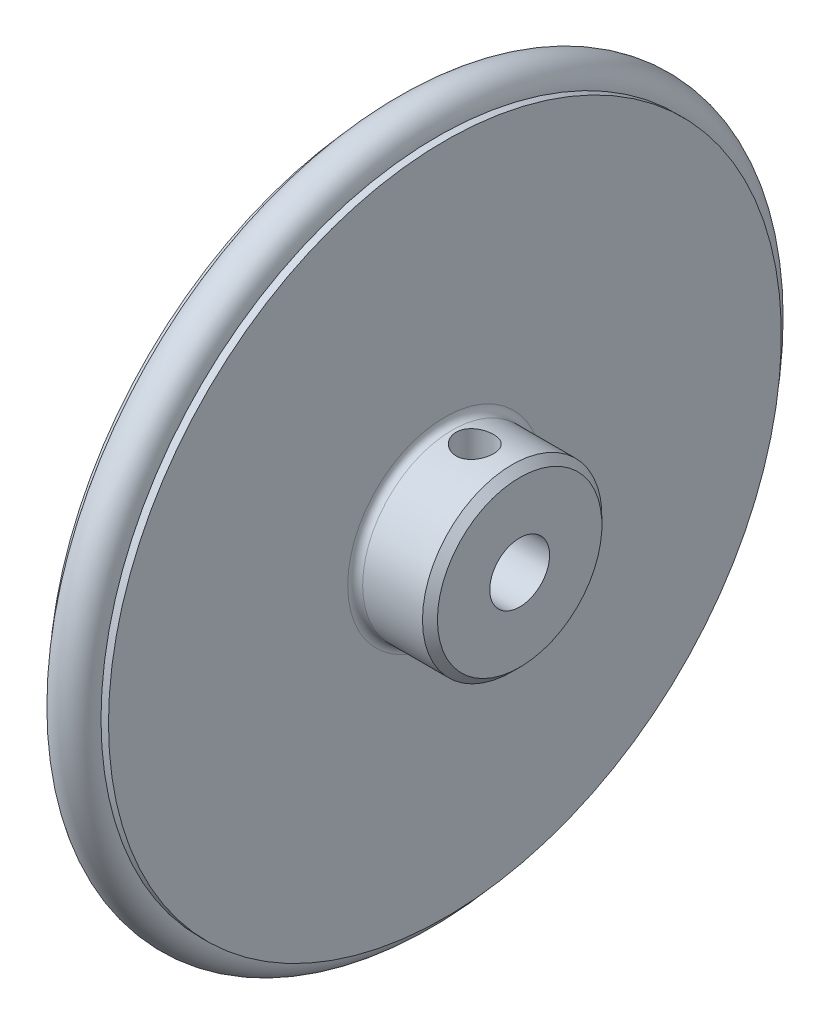
ISO-10303-21;
HEADER;
FILE_DESCRIPTION(('STEP AP214'),'2;1');
FILE_NAME('part.step','',(''),(''),'','','');
FILE_SCHEMA(('AUTOMOTIVE_DESIGN { 1 0 10303 214 1 1 1 1 }'));
ENDSEC;
DATA;
#1=APPLICATION_CONTEXT('core data for automotive mechanical design processes');
#2=APPLICATION_PROTOCOL_DEFINITION('international standard','automotive_design',2000,#1);
#3=PRODUCT_CONTEXT('',#1,'mechanical');
#4=PRODUCT('Part','Part','',(#3));
#5=PRODUCT_RELATED_PRODUCT_CATEGORY('part','',(#4));
#6=PRODUCT_DEFINITION_FORMATION('','',#4);
#7=PRODUCT_DEFINITION_CONTEXT('part definition',#1,'design');
#8=PRODUCT_DEFINITION('design','',#6,#7);
#9=PRODUCT_DEFINITION_SHAPE('','',#8);
#10=(LENGTH_UNIT() NAMED_UNIT(*) SI_UNIT(.MILLI.,.METRE.));
#11=(NAMED_UNIT(*) PLANE_ANGLE_UNIT() SI_UNIT($,.RADIAN.));
#12=(NAMED_UNIT(*) SI_UNIT($,.STERADIAN.) SOLID_ANGLE_UNIT());
#13=UNCERTAINTY_MEASURE_WITH_UNIT(LENGTH_MEASURE(1.E-05),#10,'distance_accuracy_value','');
#14=(GEOMETRIC_REPRESENTATION_CONTEXT(3) GLOBAL_UNCERTAINTY_ASSIGNED_CONTEXT((#13)) GLOBAL_UNIT_ASSIGNED_CONTEXT((#10,
#11,#12)) REPRESENTATION_CONTEXT('',''));
#15=CARTESIAN_POINT('',(0.,0.,0.));
#16=DIRECTION('',(0.,0.,1.));
#17=DIRECTION('',(1.,0.,0.));
#18=AXIS2_PLACEMENT_3D('',#15,#16,#17);
#19=CARTESIAN_POINT('',(0.,0.,0.));
#20=DIRECTION('',(1.,0.,0.));
#21=DIRECTION('',(0.,0.,-1.));
#22=AXIS2_PLACEMENT_3D('',#19,#20,#21);
#23=TOROIDAL_SURFACE('',#22,22.5,1.5);
#24=CARTESIAN_POINT('',(0.,0.,-24.));
#25=VERTEX_POINT('',#24);
#26=VERTEX_LOOP('',#25);
#27=FACE_BOUND('',#26,.T.);
#28=ADVANCED_FACE('F38',(#27),#23,.T.);
#29=CLOSED_SHELL('',(#28));
#30=MANIFOLD_SOLID_BREP('B2',#29);
#31=CARTESIAN_POINT('',(0.,0.,0.));
#32=DIRECTION('',(-1.,0.,0.));
#33=DIRECTION('',(0.,0.,1.));
#34=AXIS2_PLACEMENT_3D('',#31,#32,#33);
#35=CYLINDRICAL_SURFACE('',#34,2.);
#36=CARTESIAN_POINT('',(4.,1.56124949959961,-1.24999999999999));
#37=CARTESIAN_POINT('',(3.93787971819707,1.56125800072559,-1.24999462210484));
#38=CARTESIAN_POINT('',(3.87566216462974,1.56502642708837,-1.24532693849665));
#39=CARTESIAN_POINT('',(3.75332367992062,1.57943717205479,-1.22698950832933));
#40=CARTESIAN_POINT('',(3.69320891363476,1.59009816464116,-1.2132953043055));
#41=CARTESIAN_POINT('',(3.57721767730116,1.61650085329042,-1.1778807391187));
#42=CARTESIAN_POINT('',(3.52130939131819,1.63219837418034,-1.15622993332784));
#43=CARTESIAN_POINT('',(3.41399113836185,1.66682950714433,-1.10571945561923));
#44=CARTESIAN_POINT('',(3.3625812941435,1.68576320748676,-1.07685958706091));
#45=CARTESIAN_POINT('',(3.25813484552302,1.72779611374712,-1.00823937928363));
#46=CARTESIAN_POINT('',(3.20580525916741,1.75111338227347,-0.967536093692494));
#47=CARTESIAN_POINT('',(3.10811730085504,1.79752820854877,-0.878308664496871));
#48=CARTESIAN_POINT('',(3.06276500271608,1.8206255586333,-0.829777781297405));
#49=CARTESIAN_POINT('',(2.97489641485188,1.8672945389101,-0.719186665258484));
#50=CARTESIAN_POINT('',(2.9333823318957,1.8905872224145,-0.656200568910549));
#51=CARTESIAN_POINT('',(2.86187479523685,1.9318323169914,-0.52240407083731));
#52=CARTESIAN_POINT('',(2.83186993424875,1.94979001179838,-0.451601506478236));
#53=CARTESIAN_POINT('',(2.78751768939295,1.97669841318201,-0.311776878362014));
#54=CARTESIAN_POINT('',(2.77188858360307,1.98637922422038,-0.243305636047237));
#55=CARTESIAN_POINT('',(2.75236793035661,1.99850544379202,-0.10410510066226));
#56=CARTESIAN_POINT('',(2.74846404387946,2.00095845843657,-0.0333782605640244));
#57=CARTESIAN_POINT('',(2.75235568927762,1.99852909107528,0.0980658284213418));
#58=CARTESIAN_POINT('',(2.75865137630091,1.99458699811902,0.158852523273787));
#59=CARTESIAN_POINT('',(2.77986698436333,1.98145272261225,0.27830664590367));
#60=CARTESIAN_POINT('',(2.79478755723752,1.97226014325117,0.336973913146974));
#61=CARTESIAN_POINT('',(2.83260377509713,1.94938133614675,0.450889117077072));
#62=CARTESIAN_POINT('',(2.8555198240486,1.93568361673912,0.506127875493232));
#63=CARTESIAN_POINT('',(2.90846875526,1.90485632889331,0.612019220469381));
#64=CARTESIAN_POINT('',(2.93850325889061,1.88772597874226,0.662670758559999));
#65=CARTESIAN_POINT('',(3.00902816532938,1.84893224750793,0.764713515567039));
#66=CARTESIAN_POINT('',(3.05035462674234,1.82697004307144,0.815412344918947));
#67=CARTESIAN_POINT('',(3.14013238022338,1.78195462752237,0.909598595905495));
#68=CARTESIAN_POINT('',(3.18859402644656,1.75889986449171,0.953075338789628));
#69=CARTESIAN_POINT('',(3.29870562290611,1.71071442112196,1.03735445892931));
#70=CARTESIAN_POINT('',(3.36125138085031,1.68570581533195,1.07706615479946));
#71=CARTESIAN_POINT('',(3.49364611977343,1.640141390954,1.14526153203308));
#72=CARTESIAN_POINT('',(3.56348134395542,1.6195774019168,1.17376589603357));
#73=CARTESIAN_POINT('',(3.68976940288788,1.59091876567121,1.21218566853166));
#74=CARTESIAN_POINT('',(3.74491096263768,1.58096704305273,1.2250184172172));
#75=CARTESIAN_POINT('',(3.85711518874894,1.56679138875766,1.24310168537523));
#76=CARTESIAN_POINT('',(3.9141751210399,1.56255963237429,1.24836256353274));
#77=CARTESIAN_POINT('',(4.02872868054027,1.56046133530165,1.25098535954507));
#78=CARTESIAN_POINT('',(4.08622300136582,1.56260938140436,1.24832917576575));
#79=CARTESIAN_POINT('',(4.1997805810316,1.57296042862706,1.23525733555986));
#80=CARTESIAN_POINT('',(4.25584261496293,1.58116844404657,1.22483525320261));
#81=CARTESIAN_POINT('',(4.36421838386581,1.60230060601958,1.19704935724829));
#82=CARTESIAN_POINT('',(4.41657867333152,1.61514477937172,1.17980280626787));
#83=CARTESIAN_POINT('',(4.51778733455698,1.64415573440842,1.13902451938522));
#84=CARTESIAN_POINT('',(4.5666344520245,1.66032369489909,1.1154905527142));
#85=CARTESIAN_POINT('',(4.66930603917703,1.69787203988938,1.05765376772318));
#86=CARTESIAN_POINT('',(4.72230754124933,1.7196587573829,1.02215373814219));
#87=CARTESIAN_POINT('',(4.82218505243915,1.76393958000712,0.943690263224849));
#88=CARTESIAN_POINT('',(4.86905461697796,1.78643439903355,0.900719074496587));
#89=CARTESIAN_POINT('',(4.96298324624316,1.83383164018973,0.80038065949918));
#90=CARTESIAN_POINT('',(5.00886855700768,1.85854204787598,0.741809949714149));
#91=CARTESIAN_POINT('',(5.09006865187585,1.90384248965,0.616299987869563));
#92=CARTESIAN_POINT('',(5.12538838997364,1.92443445329133,0.549364678748648));
#93=CARTESIAN_POINT('',(5.18199499120263,1.95809255957562,0.412925900636586));
#94=CARTESIAN_POINT('',(5.20399420647076,1.9715348458918,0.343814822544506));
#95=CARTESIAN_POINT('',(5.23572666868108,1.9910701008804,0.201860998884734));
#96=CARTESIAN_POINT('',(5.2454768897611,1.99717323933003,0.129023563238356));
#97=CARTESIAN_POINT('',(5.25154652003877,2.00096685748559,-0.00659907199682216));
#98=CARTESIAN_POINT('',(5.24963577678697,1.99976600623617,-0.0692812975954833));
#99=CARTESIAN_POINT('',(5.23653832502565,1.99160739958772,-0.193279811091734));
#100=CARTESIAN_POINT('',(5.22535203742422,1.98464990541518,-0.25459616084075));
#101=CARTESIAN_POINT('',(5.19483952512339,1.9659610468898,-0.372043294685532));
#102=CARTESIAN_POINT('',(5.17580916012679,1.95440367471701,-0.428280180678315));
#103=CARTESIAN_POINT('',(5.13044007183592,1.92744968677265,-0.53671436911132));
#104=CARTESIAN_POINT('',(5.1041001155244,1.91205242331405,-0.588910988118244));
#105=CARTESIAN_POINT('',(5.04183942100878,1.87675342239824,-0.69365673747067));
#106=CARTESIAN_POINT('',(5.005208018681,1.85655002466956,-0.745680127162215));
#107=CARTESIAN_POINT('',(4.92492336966728,1.81433640456238,-0.843216608355416));
#108=CARTESIAN_POINT('',(4.88126219975404,1.7923241573062,-0.888722243055232));
#109=CARTESIAN_POINT('',(4.78088373769671,1.74500415099525,-0.978723601300806));
#110=CARTESIAN_POINT('',(4.72319165482307,1.71967871446314,-1.02212829873816));
#111=CARTESIAN_POINT('',(4.60035533398987,1.67174821497037,-1.09877325005744));
#112=CARTESIAN_POINT('',(4.53521524509239,1.64914165167052,-1.13201912557099));
#113=CARTESIAN_POINT('',(4.41359723207031,1.61429776080214,-1.1809911092323));
#114=CARTESIAN_POINT('',(4.35836431912062,1.60087340349653,-1.19896216276381));
#115=CARTESIAN_POINT('',(4.24503072204279,1.5793915843794,-1.22712822180407));
#116=CARTESIAN_POINT('',(4.18693974497584,1.57131714400176,-1.23734784245404));
#117=CARTESIAN_POINT('',(4.10696947613713,1.56476456389395,-1.24559906183096));
#118=CARTESIAN_POINT('',(4.085635854483,1.56345069546828,-1.2472467125958));
#119=CARTESIAN_POINT('',(4.04287203347851,1.56169158695047,-1.24944824734287));
#120=CARTESIAN_POINT('',(4.02144181119831,1.56124656529968,-1.25000185626672));
#121=CARTESIAN_POINT('',(4.,1.56124949959961,-1.24999999999999));
#122=B_SPLINE_CURVE_WITH_KNOTS('',3,(#36,#37,#38,#39,#40,#41,#42,#43,#44,#45,#46,#47,#48,#49,
#50,#51,#52,#53,#54,#55,#56,#57,#58,#59,#60,#61,#62,#63,#64,#65,#66,#67,#68,#69,#70,#71,#72,#73,
#74,#75,#76,#77,#78,#79,#80,#81,#82,#83,#84,#85,#86,#87,#88,#89,#90,#91,#92,#93,#94,#95,#96,#97,
#98,#99,#100,#101,#102,#103,#104,#105,#106,#107,#108,#109,#110,#111,#112,#113,#114,#115,#116,
#117,#118,#119,#120,#121),.UNSPECIFIED.,.T.,.F.,(4,2,2,2,2,2,2,2,2,2,2,2,2,2,2,2,2,2,2,2,2,2,2,
2,2,2,2,2,2,2,2,2,2,2,2,2,2,2,2,2,2,2,4),(0.,0.186262444012013,0.373031654397094,
0.558205556130399,0.743384509377746,0.953406207440068,1.1636097099791,1.39917236034456,
1.63450092739259,1.84590412815397,2.05708478092386,2.2399231958351,2.42277543076412,
2.60609774825955,2.7894618612817,2.99564504832105,3.20213044016184,3.43558067920819,
3.66859805095275,3.84032775480265,4.01182230007287,4.18370925240736,4.35573859160078,
4.52493212343596,4.69418576487133,4.89566333610126,5.09735098485251,5.33136598660886,
5.56527109061623,5.78520080494546,6.00482541258958,6.1920360152512,6.37923812308579,
6.5599456911442,6.74068376037876,6.94018144108741,7.13990556958864,7.36841817421244,
7.59680409585382,7.77496902270408,7.9525657796338,8.01684109069492,8.08113255947016),.UNSPECIFIED.);
#123=CARTESIAN_POINT('',(4.,1.56124949959961,-1.24999999999999));
#124=VERTEX_POINT('',#123);
#125=EDGE_CURVE('E54',#124,#124,#122,.T.);
#126=ORIENTED_EDGE('',*,*,#125,.T.);
#127=EDGE_LOOP('',(#126));
#128=FACE_BOUND('',#127,.T.);
#129=CARTESIAN_POINT('',(7.,0.,0.));
#130=DIRECTION('',(-1.,0.,0.));
#131=DIRECTION('',(0.,0.,1.));
#132=AXIS2_PLACEMENT_3D('',#129,#130,#131);
#133=CIRCLE('',#132,2.);
#134=CARTESIAN_POINT('',(7.,0.,2.));
#135=VERTEX_POINT('',#134);
#136=EDGE_CURVE('E75',#135,#135,#133,.T.);
#137=ORIENTED_EDGE('',*,*,#136,.F.);
#138=EDGE_LOOP('',(#137));
#139=FACE_BOUND('',#138,.T.);
#140=CARTESIAN_POINT('',(-2.,0.,0.));
#141=DIRECTION('',(-1.,0.,0.));
#142=DIRECTION('',(0.,0.,1.));
#143=AXIS2_PLACEMENT_3D('',#140,#141,#142);
#144=CIRCLE('',#143,2.);
#145=CARTESIAN_POINT('',(-2.,0.,2.));
#146=VERTEX_POINT('',#145);
#147=EDGE_CURVE('E90',#146,#146,#144,.T.);
#148=ORIENTED_EDGE('',*,*,#147,.T.);
#149=EDGE_LOOP('',(#148));
#150=FACE_BOUND('',#149,.T.);
#151=ADVANCED_FACE('F50',(#128,#139,#150),#35,.F.);
#152=CARTESIAN_POINT('',(7.,2.,0.));
#153=DIRECTION('',(-1.,0.,0.));
#154=DIRECTION('',(0.,0.,1.));
#155=AXIS2_PLACEMENT_3D('',#152,#153,#154);
#156=PLANE('',#155);
#157=CARTESIAN_POINT('',(7.,0.,0.));
#158=DIRECTION('',(-1.,0.,0.));
#159=DIRECTION('',(0.,0.,1.));
#160=AXIS2_PLACEMENT_3D('',#157,#158,#159);
#161=CIRCLE('',#160,5.5);
#162=CARTESIAN_POINT('',(7.,0.,5.5));
#163=VERTEX_POINT('',#162);
#164=EDGE_CURVE('E67',#163,#163,#161,.F.);
#165=ORIENTED_EDGE('',*,*,#164,.T.);
#166=EDGE_LOOP('',(#165));
#167=FACE_BOUND('',#166,.T.);
#168=ORIENTED_EDGE('',*,*,#136,.T.);
#169=EDGE_LOOP('',(#168));
#170=FACE_BOUND('',#169,.T.);
#171=ADVANCED_FACE('F131',(#167,#170),#156,.F.);
#172=CARTESIAN_POINT('',(0.,0.,0.));
#173=DIRECTION('',(-1.,0.,0.));
#174=DIRECTION('',(0.,0.,1.));
#175=AXIS2_PLACEMENT_3D('',#172,#173,#174);
#176=CYLINDRICAL_SURFACE('',#175,6.);
#177=CARTESIAN_POINT('',(4.,5.86834729715275,-1.24999999999999));
#178=CARTESIAN_POINT('',(4.06939061515103,5.86834869213646,-1.24999750877599));
#179=CARTESIAN_POINT('',(4.13881197201522,5.86959145924544,-1.24420229433947));
#180=CARTESIAN_POINT('',(4.27568631731725,5.87442015581798,-1.22119649233778));
#181=CARTESIAN_POINT('',(4.34313775550642,5.87800788138388,-1.20397715440341));
#182=CARTESIAN_POINT('',(4.47407237283486,5.8871029296193,-1.15868397507229));
#183=CARTESIAN_POINT('',(4.5375595959918,5.89260825706945,-1.13062141248932));
#184=CARTESIAN_POINT('',(4.6589244996456,5.90491581335741,-1.06446988601732));
#185=CARTESIAN_POINT('',(4.71680240673001,5.91171798977623,-1.02638132735819));
#186=CARTESIAN_POINT('',(4.82619537515346,5.92596934661468,-0.940636399466077));
#187=CARTESIAN_POINT('',(4.87761189362646,5.93342614373039,-0.892855554869663));
#188=CARTESIAN_POINT('',(4.9717610686481,5.94807966802575,-0.789351223880631));
#189=CARTESIAN_POINT('',(5.01449308829143,5.95527637609915,-0.733627155455997));
#190=CARTESIAN_POINT('',(5.09044588808285,5.96868135118848,-0.615162052999584));
#191=CARTESIAN_POINT('',(5.12357252646325,5.97487958631242,-0.552359428204937));
#192=CARTESIAN_POINT('',(5.17876605285977,5.98550347343302,-0.421928551006716));
#193=CARTESIAN_POINT('',(5.20083406515352,5.98992930561222,-0.354300789950588));
#194=CARTESIAN_POINT('',(5.23297576111746,5.99645589892179,-0.2171629042005));
#195=CARTESIAN_POINT('',(5.24321601719516,5.99858891959926,-0.147693380916356));
#196=CARTESIAN_POINT('',(5.25193169575701,6.00040112580612,-0.0079918488395236));
#197=CARTESIAN_POINT('',(5.25040834419309,6.0000805670369,0.0622400797368389));
#198=CARTESIAN_POINT('',(5.23576539904325,5.99704658090511,0.200326586199571));
#199=CARTESIAN_POINT('',(5.22282528104187,5.99437018956584,0.268201128726474));
#200=CARTESIAN_POINT('',(5.18600137466869,5.98696720898885,0.40079374628975));
#201=CARTESIAN_POINT('',(5.16211712279692,5.98224053291904,0.46551168751102));
#202=CARTESIAN_POINT('',(5.10391994787449,5.97120767323924,0.590460005384681));
#203=CARTESIAN_POINT('',(5.06953770579033,5.96489104125346,0.650657134981647));
#204=CARTESIAN_POINT('',(4.99137199715958,5.95137300440189,0.764493456510644));
#205=CARTESIAN_POINT('',(4.94758736179386,5.94417148958325,0.818131831816414));
#206=CARTESIAN_POINT('',(4.85087837510894,5.92951700233276,0.918394203276907));
#207=CARTESIAN_POINT('',(4.79779694001805,5.92206184975925,0.964866487494789));
#208=CARTESIAN_POINT('',(4.6845179510052,5.90786872648996,1.04827597240487));
#209=CARTESIAN_POINT('',(4.62432023861276,5.9011307717716,1.08521296069979));
#210=CARTESIAN_POINT('',(4.4982877451712,5.88912998409156,1.14856217138453));
#211=CARTESIAN_POINT('',(4.43243934930656,5.88387085232125,1.17494805489726));
#212=CARTESIAN_POINT('',(4.29710838063061,5.8754760641036,1.21623577538672));
#213=CARTESIAN_POINT('',(4.2276263271919,5.87234010507182,1.23113924882348));
#214=CARTESIAN_POINT('',(4.08838029368109,5.86860783239132,1.24880863867017));
#215=CARTESIAN_POINT('',(4.01864541546297,5.86796551863474,1.25179442917998));
#216=CARTESIAN_POINT('',(3.87967418845986,5.86916952018704,1.24613693439293));
#217=CARTESIAN_POINT('',(3.81043780909767,5.87101568152624,1.23749436857862));
#218=CARTESIAN_POINT('',(3.67517948394188,5.87694538226167,1.20901558325483));
#219=CARTESIAN_POINT('',(3.60913133282117,5.88100511282998,1.1892984137687));
#220=CARTESIAN_POINT('',(3.4812760105584,5.8908833850312,1.13935810860918));
#221=CARTESIAN_POINT('',(3.4194692143496,5.89670208191057,1.10913404556146));
#222=CARTESIAN_POINT('',(3.30089355878377,5.90954501937191,1.03854598181484));
#223=CARTESIAN_POINT('',(3.24420779553384,5.91658506648323,0.998045327353955));
#224=CARTESIAN_POINT('',(3.13835675084494,5.93103483993908,0.908234440569873));
#225=CARTESIAN_POINT('',(3.08919231376078,5.93844460766532,0.858923220505167));
#226=CARTESIAN_POINT('',(2.99893728690284,5.95294924316736,0.751900450843334));
#227=CARTESIAN_POINT('',(2.95799590497362,5.9600367471991,0.694061907614547));
#228=CARTESIAN_POINT('',(2.88641124791203,5.97296708772407,0.572200102216356));
#229=CARTESIAN_POINT('',(2.85576751776256,5.97880997920818,0.508177113476878));
#230=CARTESIAN_POINT('',(2.80586132068266,5.98856148270679,0.376142117847917));
#231=CARTESIAN_POINT('',(2.78653083445567,5.99248163136497,0.308156710970193));
#232=CARTESIAN_POINT('',(2.75958559599191,5.99799561410226,0.169813400503471));
#233=CARTESIAN_POINT('',(2.75196930646727,5.99958975342889,0.0994558094616944));
#234=CARTESIAN_POINT('',(2.7487323779515,6.00026408056941,-0.0402133434703392));
#235=CARTESIAN_POINT('',(2.75288810000528,5.99939113754811,-0.109519592177922));
#236=CARTESIAN_POINT('',(2.77258063865294,5.99532874094472,-0.246422870373551));
#237=CARTESIAN_POINT('',(2.78811728640678,5.99213932172839,-0.314019925202701));
#238=CARTESIAN_POINT('',(2.83002779464857,5.98380460077544,-0.44543196549205));
#239=CARTESIAN_POINT('',(2.85637266385311,5.97866453407556,-0.509256550004521));
#240=CARTESIAN_POINT('',(2.91912239773201,5.96697995347704,-0.631610567220738));
#241=CARTESIAN_POINT('',(2.95552813834314,5.96043531730246,-0.690139538279507));
#242=CARTESIAN_POINT('',(3.03810966799331,5.94651596786386,-0.801340321298256));
#243=CARTESIAN_POINT('',(3.08444428805671,5.93912880302851,-0.853892633615922));
#244=CARTESIAN_POINT('',(3.18524450099709,5.9244278681135,-0.95055274198038));
#245=CARTESIAN_POINT('',(3.23971202994844,5.91711411595368,-0.994658521571227));
#246=CARTESIAN_POINT('',(3.35600910243344,5.90329191643327,-1.07367451852767));
#247=CARTESIAN_POINT('',(3.4179184114621,5.89679406702551,-1.10846928126993));
#248=CARTESIAN_POINT('',(3.54682515608327,5.88547039658063,-1.16710627925305));
#249=CARTESIAN_POINT('',(3.61381804845301,5.88064310352601,-1.19095816292459));
#250=CARTESIAN_POINT('',(3.73410628156844,5.87414004405196,-1.2225655413186));
#251=CARTESIAN_POINT('',(3.78672953659306,5.87198163591589,-1.23283449005669));
#252=CARTESIAN_POINT('',(3.89289578052101,5.86908475266778,-1.24655254358403));
#253=CARTESIAN_POINT('',(3.94643873231004,5.86834622039194,-1.2500019229274));
#254=CARTESIAN_POINT('',(4.,5.86834729715275,-1.24999999999999));
#255=B_SPLINE_CURVE_WITH_KNOTS('',3,(#177,#178,#179,#180,#181,#182,#183,#184,#185,#186,#187,
#188,#189,#190,#191,#192,#193,#194,#195,#196,#197,#198,#199,#200,#201,#202,#203,#204,#205,#206,
#207,#208,#209,#210,#211,#212,#213,#214,#215,#216,#217,#218,#219,#220,#221,#222,#223,#224,#225,
#226,#227,#228,#229,#230,#231,#232,#233,#234,#235,#236,#237,#238,#239,#240,#241,#242,#243,#244,
#245,#246,#247,#248,#249,#250,#251,#252,#253,#254),.UNSPECIFIED.,.T.,.F.,(4,2,2,2,2,2,2,2,2,2,2,
2,2,2,2,2,2,2,2,2,2,2,2,2,2,2,2,2,2,2,2,2,2,2,2,2,2,2,4),(0.,0.207975654071268,
0.416110792417468,0.624030014802725,0.831940834815786,1.04271333467884,1.25350128663873,
1.46629026266843,1.67905760106932,1.88879048859263,2.09850151896337,2.3049734141646,
2.51145405455869,2.71932871977948,2.92722924104258,3.13905862244911,3.35089272191626,
3.56325237332485,3.77558175387594,3.98397516009789,4.19235567296521,4.3985378623192,
4.60473825464028,4.81383917934648,5.02296356082183,5.2355945875334,5.44821621759037,
5.65954599648531,5.87084803959577,6.07816293922641,6.28547476332977,6.49223410585097,
6.69901145528169,6.90938318978569,7.11980508427531,7.33272651358119,7.54545984571983,
7.70599867585765,7.86653104261156),.UNSPECIFIED.);
#256=CARTESIAN_POINT('',(4.,5.86834729715275,-1.24999999999999));
#257=VERTEX_POINT('',#256);
#258=EDGE_CURVE('E93',#257,#257,#255,.T.);
#259=ORIENTED_EDGE('',*,*,#258,.T.);
#260=EDGE_LOOP('',(#259));
#261=FACE_BOUND('',#260,.T.);
#262=CARTESIAN_POINT('',(2.5,0.,0.));
#263=DIRECTION('',(-1.,0.,0.));
#264=DIRECTION('',(0.,0.,1.));
#265=AXIS2_PLACEMENT_3D('',#262,#263,#264);
#266=CIRCLE('',#265,6.);
#267=CARTESIAN_POINT('',(2.5,0.,6.));
#268=VERTEX_POINT('',#267);
#269=EDGE_CURVE('E37',#268,#268,#266,.F.);
#270=ORIENTED_EDGE('',*,*,#269,.T.);
#271=EDGE_LOOP('',(#270));
#272=FACE_BOUND('',#271,.T.);
#273=CARTESIAN_POINT('',(6.5,0.,0.));
#274=DIRECTION('',(-1.,0.,0.));
#275=DIRECTION('',(0.,0.,1.));
#276=AXIS2_PLACEMENT_3D('',#273,#274,#275);
#277=CIRCLE('',#276,6.);
#278=CARTESIAN_POINT('',(6.5,0.,6.));
#279=VERTEX_POINT('',#278);
#280=EDGE_CURVE('E72',#279,#279,#277,.T.);
#281=ORIENTED_EDGE('',*,*,#280,.T.);
#282=EDGE_LOOP('',(#281));
#283=FACE_BOUND('',#282,.T.);
#284=ADVANCED_FACE('F99',(#261,#272,#283),#176,.T.);
#285=CARTESIAN_POINT('',(2.,6.,0.));
#286=DIRECTION('',(-1.,0.,0.));
#287=DIRECTION('',(0.,0.,1.));
#288=AXIS2_PLACEMENT_3D('',#285,#286,#287);
#289=PLANE('',#288);
#290=CARTESIAN_POINT('',(2.,0.,0.));
#291=DIRECTION('',(-1.,0.,0.));
#292=DIRECTION('',(0.,0.,1.));
#293=AXIS2_PLACEMENT_3D('',#290,#291,#292);
#294=CIRCLE('',#293,6.5);
#295=CARTESIAN_POINT('',(2.,0.,6.5));
#296=VERTEX_POINT('',#295);
#297=EDGE_CURVE('E63',#296,#296,#294,.T.);
#298=ORIENTED_EDGE('',*,*,#297,.T.);
#299=EDGE_LOOP('',(#298));
#300=FACE_BOUND('',#299,.T.);
#301=CARTESIAN_POINT('',(2.,0.,0.));
#302=DIRECTION('',(-1.,0.,0.));
#303=DIRECTION('',(0.,0.,1.));
#304=AXIS2_PLACEMENT_3D('',#301,#302,#303);
#305=CIRCLE('',#304,22.5);
#306=CARTESIAN_POINT('',(2.,0.,22.5));
#307=VERTEX_POINT('',#306);
#308=EDGE_CURVE('E78',#307,#307,#305,.T.);
#309=ORIENTED_EDGE('',*,*,#308,.F.);
#310=EDGE_LOOP('',(#309));
#311=FACE_BOUND('',#310,.T.);
#312=ADVANCED_FACE('F124',(#300,#311),#289,.F.);
#313=CARTESIAN_POINT('',(0.,0.,0.));
#314=DIRECTION('',(-1.,0.,0.));
#315=DIRECTION('',(0.,0.,1.));
#316=AXIS2_PLACEMENT_3D('',#313,#314,#315);
#317=CYLINDRICAL_SURFACE('',#316,22.5);
#318=CARTESIAN_POINT('',(1.5,0.,0.));
#319=DIRECTION('',(-1.,0.,0.));
#320=DIRECTION('',(0.,0.,1.));
#321=AXIS2_PLACEMENT_3D('',#318,#319,#320);
#322=CIRCLE('',#321,22.5);
#323=CARTESIAN_POINT('',(1.5,0.,22.5));
#324=VERTEX_POINT('',#323);
#325=EDGE_CURVE('E81',#324,#324,#322,.T.);
#326=ORIENTED_EDGE('',*,*,#325,.F.);
#327=EDGE_LOOP('',(#326));
#328=FACE_BOUND('',#327,.T.);
#329=ORIENTED_EDGE('',*,*,#308,.T.);
#330=EDGE_LOOP('',(#329));
#331=FACE_BOUND('',#330,.T.);
#332=ADVANCED_FACE('F121',(#328,#331),#317,.T.);
#333=CARTESIAN_POINT('',(0.,0.,0.));
#334=DIRECTION('',(-1.,0.,0.));
#335=DIRECTION('',(0.,0.,1.));
#336=AXIS2_PLACEMENT_3D('',#333,#334,#335);
#337=TOROIDAL_SURFACE('',#336,22.5,1.5);
#338=CARTESIAN_POINT('',(-1.5,0.,0.));
#339=DIRECTION('',(-1.,0.,0.));
#340=DIRECTION('',(0.,0.,1.));
#341=AXIS2_PLACEMENT_3D('',#338,#339,#340);
#342=CIRCLE('',#341,22.5);
#343=CARTESIAN_POINT('',(-1.5,0.,22.5));
#344=VERTEX_POINT('',#343);
#345=EDGE_CURVE('E84',#344,#344,#342,.T.);
#346=ORIENTED_EDGE('',*,*,#345,.F.);
#347=EDGE_LOOP('',(#346));
#348=FACE_BOUND('',#347,.T.);
#349=ORIENTED_EDGE('',*,*,#325,.T.);
#350=EDGE_LOOP('',(#349));
#351=FACE_BOUND('',#350,.T.);
#352=ADVANCED_FACE('F117',(#348,#351),#337,.F.);
#353=CARTESIAN_POINT('',(0.,0.,0.));
#354=DIRECTION('',(-1.,0.,0.));
#355=DIRECTION('',(0.,0.,1.));
#356=AXIS2_PLACEMENT_3D('',#353,#354,#355);
#357=CYLINDRICAL_SURFACE('',#356,22.5);
#358=CARTESIAN_POINT('',(-2.,0.,0.));
#359=DIRECTION('',(-1.,0.,0.));
#360=DIRECTION('',(0.,0.,1.));
#361=AXIS2_PLACEMENT_3D('',#358,#359,#360);
#362=CIRCLE('',#361,22.5);
#363=CARTESIAN_POINT('',(-2.,0.,22.5));
#364=VERTEX_POINT('',#363);
#365=EDGE_CURVE('E87',#364,#364,#362,.T.);
#366=ORIENTED_EDGE('',*,*,#365,.F.);
#367=EDGE_LOOP('',(#366));
#368=FACE_BOUND('',#367,.T.);
#369=ORIENTED_EDGE('',*,*,#345,.T.);
#370=EDGE_LOOP('',(#369));
#371=FACE_BOUND('',#370,.T.);
#372=ADVANCED_FACE('F113',(#368,#371),#357,.T.);
#373=CARTESIAN_POINT('',(-2.,2.,0.));
#374=DIRECTION('',(1.,0.,0.));
#375=DIRECTION('',(0.,0.,-1.));
#376=AXIS2_PLACEMENT_3D('',#373,#374,#375);
#377=PLANE('',#376);
#378=ORIENTED_EDGE('',*,*,#147,.F.);
#379=EDGE_LOOP('',(#378));
#380=FACE_BOUND('',#379,.T.);
#381=ORIENTED_EDGE('',*,*,#365,.T.);
#382=EDGE_LOOP('',(#381));
#383=FACE_BOUND('',#382,.T.);
#384=ADVANCED_FACE('F108',(#380,#383),#377,.F.);
#385=CARTESIAN_POINT('',(6.5,0.,0.));
#386=DIRECTION('',(-1.,0.,0.));
#387=DIRECTION('',(0.,0.,1.));
#388=AXIS2_PLACEMENT_3D('',#385,#386,#387);
#389=CONICAL_SURFACE('',#388,6.,0.785398163397447);
#390=ORIENTED_EDGE('',*,*,#164,.F.);
#391=EDGE_LOOP('',(#390));
#392=FACE_BOUND('',#391,.T.);
#393=ORIENTED_EDGE('',*,*,#280,.F.);
#394=EDGE_LOOP('',(#393));
#395=FACE_BOUND('',#394,.T.);
#396=ADVANCED_FACE('F112',(#392,#395),#389,.T.);
#397=CARTESIAN_POINT('',(2.5,0.,0.));
#398=DIRECTION('',(-1.,0.,0.));
#399=DIRECTION('',(0.,0.,1.));
#400=AXIS2_PLACEMENT_3D('',#397,#398,#399);
#401=TOROIDAL_SURFACE('',#400,6.5,0.5);
#402=ORIENTED_EDGE('',*,*,#269,.F.);
#403=EDGE_LOOP('',(#402));
#404=FACE_BOUND('',#403,.T.);
#405=ORIENTED_EDGE('',*,*,#297,.F.);
#406=EDGE_LOOP('',(#405));
#407=FACE_BOUND('',#406,.T.);
#408=ADVANCED_FACE('F52',(#404,#407),#401,.F.);
#409=CARTESIAN_POINT('',(4.,0.,0.));
#410=DIRECTION('',(0.,-1.,0.));
#411=DIRECTION('',(0.,0.,-1.));
#412=AXIS2_PLACEMENT_3D('',#409,#410,#411);
#413=CYLINDRICAL_SURFACE('',#412,1.24999999999999);
#414=ORIENTED_EDGE('',*,*,#125,.F.);
#415=EDGE_LOOP('',(#414));
#416=FACE_BOUND('',#415,.T.);
#417=ORIENTED_EDGE('',*,*,#258,.F.);
#418=EDGE_LOOP('',(#417));
#419=FACE_BOUND('',#418,.T.);
#420=ADVANCED_FACE('F103',(#416,#419),#413,.F.);
#421=CLOSED_SHELL('',(#151,#171,#284,#312,#332,#352,#372,#384,#396,#408,#420));
#422=MANIFOLD_SOLID_BREP('B6',#421);
#423=ADVANCED_BREP_SHAPE_REPRESENTATION('',(#18,#30,#422),#14);
#424=SHAPE_DEFINITION_REPRESENTATION(#9,#423);
ENDSEC;
END-ISO-10303-21;
